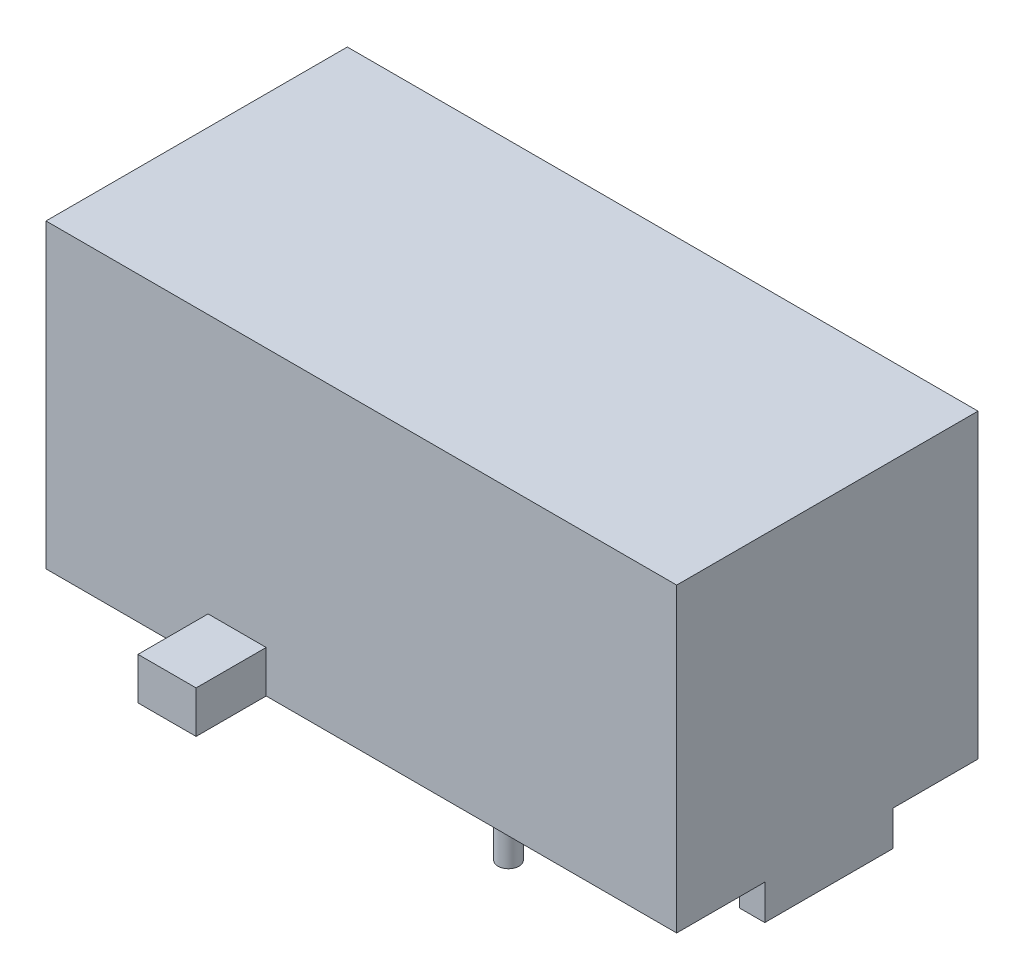
ISO-10303-21;
HEADER;
FILE_DESCRIPTION(('STEP AP214'),'2;1');
FILE_NAME('part.step','',(''),(''),'','','');
FILE_SCHEMA(('AUTOMOTIVE_DESIGN { 1 0 10303 214 1 1 1 1 }'));
ENDSEC;
DATA;
#1=APPLICATION_CONTEXT('core data for automotive mechanical design processes');
#2=APPLICATION_PROTOCOL_DEFINITION('international standard','automotive_design',2000,#1);
#3=PRODUCT_CONTEXT('',#1,'mechanical');
#4=PRODUCT('Part','Part','',(#3));
#5=PRODUCT_RELATED_PRODUCT_CATEGORY('part','',(#4));
#6=PRODUCT_DEFINITION_FORMATION('','',#4);
#7=PRODUCT_DEFINITION_CONTEXT('part definition',#1,'design');
#8=PRODUCT_DEFINITION('design','',#6,#7);
#9=PRODUCT_DEFINITION_SHAPE('','',#8);
#10=(LENGTH_UNIT() NAMED_UNIT(*) SI_UNIT(.MILLI.,.METRE.));
#11=(NAMED_UNIT(*) PLANE_ANGLE_UNIT() SI_UNIT($,.RADIAN.));
#12=(NAMED_UNIT(*) SI_UNIT($,.STERADIAN.) SOLID_ANGLE_UNIT());
#13=UNCERTAINTY_MEASURE_WITH_UNIT(LENGTH_MEASURE(1.E-05),#10,'distance_accuracy_value','');
#14=(GEOMETRIC_REPRESENTATION_CONTEXT(3) GLOBAL_UNCERTAINTY_ASSIGNED_CONTEXT((#13)) GLOBAL_UNIT_ASSIGNED_CONTEXT((#10,
#11,#12)) REPRESENTATION_CONTEXT('',''));
#15=CARTESIAN_POINT('',(0.,0.,0.));
#16=DIRECTION('',(0.,0.,1.));
#17=DIRECTION('',(1.,0.,0.));
#18=AXIS2_PLACEMENT_3D('',#15,#16,#17);
#19=CARTESIAN_POINT('',(90.,0.,43.));
#20=DIRECTION('',(0.,0.,-1.));
#21=DIRECTION('',(-1.,0.,0.));
#22=AXIS2_PLACEMENT_3D('',#19,#20,#21);
#23=PLANE('',#22);
#24=DIRECTION('',(0.,-1.,0.));
#25=VECTOR('',#24,1.);
#26=CARTESIAN_POINT('',(23.1283747452693,0.,43.));
#27=LINE('',#26,#25);
#28=CARTESIAN_POINT('',(23.1283747452693,6.0018560531816,43.));
#29=VERTEX_POINT('',#28);
#30=CARTESIAN_POINT('',(23.1283747452694,0.,43.));
#31=VERTEX_POINT('',#30);
#32=EDGE_CURVE('E49',#29,#31,#27,.T.);
#33=ORIENTED_EDGE('',*,*,#32,.F.);
#34=DIRECTION('',(-1.,0.,0.));
#35=VECTOR('',#34,1.);
#36=CARTESIAN_POINT('',(23.1283747452693,6.0018560531816,43.));
#37=LINE('',#36,#35);
#38=CARTESIAN_POINT('',(31.4201863092194,6.0018560531816,43.));
#39=VERTEX_POINT('',#38);
#40=EDGE_CURVE('E142',#39,#29,#37,.T.);
#41=ORIENTED_EDGE('',*,*,#40,.F.);
#42=DIRECTION('',(0.,1.,0.));
#43=VECTOR('',#42,1.);
#44=CARTESIAN_POINT('',(31.4201863092194,0.,43.));
#45=LINE('',#44,#43);
#46=CARTESIAN_POINT('',(31.4201863092194,0.,43.));
#47=VERTEX_POINT('',#46);
#48=EDGE_CURVE('E244',#47,#39,#45,.T.);
#49=ORIENTED_EDGE('',*,*,#48,.F.);
#50=DIRECTION('',(-1.,0.,0.));
#51=VECTOR('',#50,1.);
#52=CARTESIAN_POINT('',(90.,0.,43.));
#53=LINE('',#52,#51);
#54=CARTESIAN_POINT('',(90.,0.,43.));
#55=VERTEX_POINT('',#54);
#56=EDGE_CURVE('E202',#55,#47,#53,.T.);
#57=ORIENTED_EDGE('',*,*,#56,.F.);
#58=DIRECTION('',(0.,-1.,0.));
#59=VECTOR('',#58,1.);
#60=CARTESIAN_POINT('',(90.,0.,43.));
#61=LINE('',#60,#59);
#62=CARTESIAN_POINT('',(90.,43.,43.));
#63=VERTEX_POINT('',#62);
#64=EDGE_CURVE('E186',#63,#55,#61,.T.);
#65=ORIENTED_EDGE('',*,*,#64,.F.);
#66=DIRECTION('',(-1.,0.,0.));
#67=VECTOR('',#66,1.);
#68=CARTESIAN_POINT('',(90.,43.,43.));
#69=LINE('',#68,#67);
#70=CARTESIAN_POINT('',(0.,43.,43.));
#71=VERTEX_POINT('',#70);
#72=EDGE_CURVE('E204',#63,#71,#69,.T.);
#73=ORIENTED_EDGE('',*,*,#72,.T.);
#74=DIRECTION('',(0.,-1.,0.));
#75=VECTOR('',#74,1.);
#76=CARTESIAN_POINT('',(0.,0.,43.));
#77=LINE('',#76,#75);
#78=CARTESIAN_POINT('',(0.,0.,43.));
#79=VERTEX_POINT('',#78);
#80=EDGE_CURVE('E197',#71,#79,#77,.T.);
#81=ORIENTED_EDGE('',*,*,#80,.T.);
#82=EDGE_CURVE('E54',#31,#79,#53,.T.);
#83=ORIENTED_EDGE('',*,*,#82,.F.);
#84=EDGE_LOOP('',(#33,#41,#49,#57,#65,#73,#81,#83));
#85=FACE_BOUND('',#84,.T.);
#86=ADVANCED_FACE('F34',(#85),#23,.F.);
#87=CARTESIAN_POINT('',(90.,0.,0.));
#88=DIRECTION('',(0.,1.,0.));
#89=DIRECTION('',(0.,0.,1.));
#90=AXIS2_PLACEMENT_3D('',#87,#88,#89);
#91=PLANE('',#90);
#92=CARTESIAN_POINT('',(40.,0.,17.));
#93=DIRECTION('',(0.,1.,0.));
#94=DIRECTION('',(0.,0.,1.));
#95=AXIS2_PLACEMENT_3D('',#92,#93,#94);
#96=CIRCLE('',#95,1.5);
#97=CARTESIAN_POINT('',(40.,0.,18.5));
#98=VERTEX_POINT('',#97);
#99=EDGE_CURVE('E11',#98,#98,#96,.F.);
#100=ORIENTED_EDGE('',*,*,#99,.F.);
#101=EDGE_LOOP('',(#100));
#102=FACE_BOUND('',#101,.T.);
#103=DIRECTION('',(-1.,0.,0.));
#104=VECTOR('',#103,1.);
#105=CARTESIAN_POINT('',(90.,0.,30.429894194171));
#106=LINE('',#105,#104);
#107=CARTESIAN_POINT('',(90.,0.,30.429894194171));
#108=VERTEX_POINT('',#107);
#109=CARTESIAN_POINT('',(86.4005907050114,0.,30.429894194171));
#110=VERTEX_POINT('',#109);
#111=EDGE_CURVE('E145',#108,#110,#106,.T.);
#112=ORIENTED_EDGE('',*,*,#111,.F.);
#113=DIRECTION('',(0.,0.,-1.));
#114=VECTOR('',#113,1.);
#115=CARTESIAN_POINT('',(90.,0.,0.));
#116=LINE('',#115,#114);
#117=EDGE_CURVE('E189',#55,#108,#116,.T.);
#118=ORIENTED_EDGE('',*,*,#117,.F.);
#119=ORIENTED_EDGE('',*,*,#56,.T.);
#120=DIRECTION('',(0.,0.,-1.));
#121=VECTOR('',#120,1.);
#122=CARTESIAN_POINT('',(31.4201863092194,0.,53.));
#123=LINE('',#122,#121);
#124=CARTESIAN_POINT('',(31.4201863092194,0.,53.));
#125=VERTEX_POINT('',#124);
#126=EDGE_CURVE('E129',#125,#47,#123,.T.);
#127=ORIENTED_EDGE('',*,*,#126,.F.);
#128=DIRECTION('',(1.,0.,0.));
#129=VECTOR('',#128,1.);
#130=CARTESIAN_POINT('',(23.1283747452693,0.,53.));
#131=LINE('',#130,#129);
#132=CARTESIAN_POINT('',(23.1283747452693,0.,53.));
#133=VERTEX_POINT('',#132);
#134=EDGE_CURVE('E121',#133,#125,#131,.T.);
#135=ORIENTED_EDGE('',*,*,#134,.F.);
#136=DIRECTION('',(0.,0.,-1.));
#137=VECTOR('',#136,1.);
#138=CARTESIAN_POINT('',(23.1283747452693,0.,53.));
#139=LINE('',#138,#137);
#140=EDGE_CURVE('E126',#133,#31,#139,.T.);
#141=ORIENTED_EDGE('',*,*,#140,.T.);
#142=ORIENTED_EDGE('',*,*,#82,.T.);
#143=DIRECTION('',(0.,0.,-1.));
#144=VECTOR('',#143,1.);
#145=CARTESIAN_POINT('',(0.,0.,0.));
#146=LINE('',#145,#144);
#147=CARTESIAN_POINT('',(0.,0.,0.));
#148=VERTEX_POINT('',#147);
#149=EDGE_CURVE('E184',#79,#148,#146,.T.);
#150=ORIENTED_EDGE('',*,*,#149,.T.);
#151=DIRECTION('',(-1.,0.,0.));
#152=VECTOR('',#151,1.);
#153=CARTESIAN_POINT('',(90.,0.,0.));
#154=LINE('',#153,#152);
#155=CARTESIAN_POINT('',(90.,0.,0.));
#156=VERTEX_POINT('',#155);
#157=EDGE_CURVE('E192',#156,#148,#154,.T.);
#158=ORIENTED_EDGE('',*,*,#157,.F.);
#159=CARTESIAN_POINT('',(90.,0.,12.1029587985344));
#160=VERTEX_POINT('',#159);
#161=EDGE_CURVE('E188',#160,#156,#116,.T.);
#162=ORIENTED_EDGE('',*,*,#161,.F.);
#163=DIRECTION('',(1.,0.,0.));
#164=VECTOR('',#163,1.);
#165=CARTESIAN_POINT('',(90.,0.,12.1029587985344));
#166=LINE('',#165,#164);
#167=CARTESIAN_POINT('',(86.4005907050114,0.,12.1029587985344));
#168=VERTEX_POINT('',#167);
#169=EDGE_CURVE('E157',#168,#160,#166,.T.);
#170=ORIENTED_EDGE('',*,*,#169,.F.);
#171=DIRECTION('',(0.,0.,-1.));
#172=VECTOR('',#171,1.);
#173=CARTESIAN_POINT('',(86.4005907050114,0.,30.429894194171));
#174=LINE('',#173,#172);
#175=EDGE_CURVE('E147',#110,#168,#174,.T.);
#176=ORIENTED_EDGE('',*,*,#175,.F.);
#177=EDGE_LOOP('',(#112,#118,#119,#127,#135,#141,#142,#150,#158,#162,#170,#176));
#178=FACE_BOUND('',#177,.T.);
#179=ADVANCED_FACE('F124',(#102,#178),#91,.F.);
#180=CARTESIAN_POINT('',(90.,0.,0.));
#181=DIRECTION('',(0.,0.,1.));
#182=DIRECTION('',(1.,0.,0.));
#183=AXIS2_PLACEMENT_3D('',#180,#181,#182);
#184=PLANE('',#183);
#185=DIRECTION('',(0.,1.,0.));
#186=VECTOR('',#185,1.);
#187=CARTESIAN_POINT('',(0.,0.,0.));
#188=LINE('',#187,#186);
#189=CARTESIAN_POINT('',(0.,43.,0.));
#190=VERTEX_POINT('',#189);
#191=EDGE_CURVE('E179',#148,#190,#188,.T.);
#192=ORIENTED_EDGE('',*,*,#191,.T.);
#193=DIRECTION('',(-1.,0.,0.));
#194=VECTOR('',#193,1.);
#195=CARTESIAN_POINT('',(90.,43.,0.));
#196=LINE('',#195,#194);
#197=CARTESIAN_POINT('',(90.,43.,0.));
#198=VERTEX_POINT('',#197);
#199=EDGE_CURVE('E42',#198,#190,#196,.T.);
#200=ORIENTED_EDGE('',*,*,#199,.F.);
#201=DIRECTION('',(0.,1.,0.));
#202=VECTOR('',#201,1.);
#203=CARTESIAN_POINT('',(90.,0.,0.));
#204=LINE('',#203,#202);
#205=EDGE_CURVE('E180',#156,#198,#204,.T.);
#206=ORIENTED_EDGE('',*,*,#205,.F.);
#207=ORIENTED_EDGE('',*,*,#157,.T.);
#208=EDGE_LOOP('',(#192,#200,#206,#207));
#209=FACE_BOUND('',#208,.T.);
#210=ADVANCED_FACE('F36',(#209),#184,.F.);
#211=CARTESIAN_POINT('',(90.,43.,0.));
#212=DIRECTION('',(0.,-1.,0.));
#213=DIRECTION('',(0.,0.,-1.));
#214=AXIS2_PLACEMENT_3D('',#211,#212,#213);
#215=PLANE('',#214);
#216=DIRECTION('',(0.,0.,1.));
#217=VECTOR('',#216,1.);
#218=CARTESIAN_POINT('',(0.,43.,0.));
#219=LINE('',#218,#217);
#220=EDGE_CURVE('E195',#190,#71,#219,.T.);
#221=ORIENTED_EDGE('',*,*,#220,.T.);
#222=ORIENTED_EDGE('',*,*,#72,.F.);
#223=DIRECTION('',(0.,0.,1.));
#224=VECTOR('',#223,1.);
#225=CARTESIAN_POINT('',(90.,43.,0.));
#226=LINE('',#225,#224);
#227=EDGE_CURVE('E183',#198,#63,#226,.T.);
#228=ORIENTED_EDGE('',*,*,#227,.F.);
#229=ORIENTED_EDGE('',*,*,#199,.T.);
#230=EDGE_LOOP('',(#221,#222,#228,#229));
#231=FACE_BOUND('',#230,.T.);
#232=ADVANCED_FACE('F209',(#231),#215,.F.);
#233=CARTESIAN_POINT('',(90.,0.,0.));
#234=DIRECTION('',(1.,0.,0.));
#235=DIRECTION('',(0.,0.,-1.));
#236=AXIS2_PLACEMENT_3D('',#233,#234,#235);
#237=PLANE('',#236);
#238=ORIENTED_EDGE('',*,*,#205,.T.);
#239=ORIENTED_EDGE('',*,*,#227,.T.);
#240=ORIENTED_EDGE('',*,*,#64,.T.);
#241=ORIENTED_EDGE('',*,*,#117,.T.);
#242=DIRECTION('',(0.,1.,0.));
#243=VECTOR('',#242,1.);
#244=CARTESIAN_POINT('',(90.,-5.,30.429894194171));
#245=LINE('',#244,#243);
#246=CARTESIAN_POINT('',(90.,-5.,30.429894194171));
#247=VERTEX_POINT('',#246);
#248=EDGE_CURVE('E174',#247,#108,#245,.T.);
#249=ORIENTED_EDGE('',*,*,#248,.F.);
#250=DIRECTION('',(0.,0.,1.));
#251=VECTOR('',#250,1.);
#252=CARTESIAN_POINT('',(90.,-5.,30.429894194171));
#253=LINE('',#252,#251);
#254=CARTESIAN_POINT('',(90.,-5.,12.1029587985344));
#255=VERTEX_POINT('',#254);
#256=EDGE_CURVE('E153',#255,#247,#253,.T.);
#257=ORIENTED_EDGE('',*,*,#256,.F.);
#258=DIRECTION('',(0.,1.,0.));
#259=VECTOR('',#258,1.);
#260=CARTESIAN_POINT('',(90.,-5.,12.1029587985344));
#261=LINE('',#260,#259);
#262=EDGE_CURVE('E162',#255,#160,#261,.T.);
#263=ORIENTED_EDGE('',*,*,#262,.T.);
#264=ORIENTED_EDGE('',*,*,#161,.T.);
#265=EDGE_LOOP('',(#238,#239,#240,#241,#249,#257,#263,#264));
#266=FACE_BOUND('',#265,.T.);
#267=ADVANCED_FACE('F223',(#266),#237,.T.);
#268=CARTESIAN_POINT('',(0.,0.,0.));
#269=DIRECTION('',(1.,0.,0.));
#270=DIRECTION('',(0.,0.,-1.));
#271=AXIS2_PLACEMENT_3D('',#268,#269,#270);
#272=PLANE('',#271);
#273=ORIENTED_EDGE('',*,*,#191,.F.);
#274=ORIENTED_EDGE('',*,*,#149,.F.);
#275=ORIENTED_EDGE('',*,*,#80,.F.);
#276=ORIENTED_EDGE('',*,*,#220,.F.);
#277=EDGE_LOOP('',(#273,#274,#275,#276));
#278=FACE_BOUND('',#277,.T.);
#279=ADVANCED_FACE('F217',(#278),#272,.F.);
#280=CARTESIAN_POINT('',(40.,-29.,17.));
#281=DIRECTION('',(0.,1.,0.));
#282=DIRECTION('',(0.,0.,1.));
#283=AXIS2_PLACEMENT_3D('',#280,#281,#282);
#284=CYLINDRICAL_SURFACE('',#283,1.5);
#285=CARTESIAN_POINT('',(40.,-29.,17.));
#286=DIRECTION('',(0.,-1.,0.));
#287=DIRECTION('',(0.,0.,-1.));
#288=AXIS2_PLACEMENT_3D('',#285,#286,#287);
#289=CIRCLE('',#288,1.5);
#290=CARTESIAN_POINT('',(40.,-29.,18.5));
#291=VERTEX_POINT('',#290);
#292=EDGE_CURVE('E176',#291,#291,#289,.T.);
#293=CARTESIAN_POINT('',(40.,-29.,18.5));
#294=CARTESIAN_POINT('',(40.,-28.6979166666667,18.5));
#295=CARTESIAN_POINT('',(40.,-28.3958333333333,18.5));
#296=CARTESIAN_POINT('',(40.,-27.7916666666667,18.5));
#297=CARTESIAN_POINT('',(40.,-27.4895833333333,18.5));
#298=CARTESIAN_POINT('',(40.,-26.8854166666667,18.5));
#299=CARTESIAN_POINT('',(40.,-26.5833333333333,18.5));
#300=CARTESIAN_POINT('',(40.,-25.9791666666667,18.5));
#301=CARTESIAN_POINT('',(40.,-25.6770833333333,18.5));
#302=CARTESIAN_POINT('',(40.,-25.0729166666667,18.5));
#303=CARTESIAN_POINT('',(40.,-24.7708333333333,18.5));
#304=CARTESIAN_POINT('',(40.,-24.1666666666667,18.5));
#305=CARTESIAN_POINT('',(40.,-23.8645833333333,18.5));
#306=CARTESIAN_POINT('',(40.,-23.2604166666667,18.5));
#307=CARTESIAN_POINT('',(40.,-22.9583333333333,18.5));
#308=CARTESIAN_POINT('',(40.,-22.3541666666667,18.5));
#309=CARTESIAN_POINT('',(40.,-22.0520833333333,18.5));
#310=CARTESIAN_POINT('',(40.,-21.4479166666667,18.5));
#311=CARTESIAN_POINT('',(40.,-21.1458333333333,18.5));
#312=CARTESIAN_POINT('',(40.,-20.5416666666667,18.5));
#313=CARTESIAN_POINT('',(40.,-20.2395833333333,18.5));
#314=CARTESIAN_POINT('',(40.,-19.6354166666667,18.5));
#315=CARTESIAN_POINT('',(40.,-19.3333333333333,18.5));
#316=CARTESIAN_POINT('',(40.,-18.7291666666667,18.5));
#317=CARTESIAN_POINT('',(40.,-18.4270833333333,18.5));
#318=CARTESIAN_POINT('',(40.,-17.8229166666667,18.5));
#319=CARTESIAN_POINT('',(40.,-17.5208333333333,18.5));
#320=CARTESIAN_POINT('',(40.,-16.9166666666667,18.5));
#321=CARTESIAN_POINT('',(40.,-16.6145833333333,18.5));
#322=CARTESIAN_POINT('',(40.,-16.0104166666667,18.5));
#323=CARTESIAN_POINT('',(40.,-15.7083333333333,18.5));
#324=CARTESIAN_POINT('',(40.,-15.1041666666667,18.5));
#325=CARTESIAN_POINT('',(40.,-14.8020833333333,18.5));
#326=CARTESIAN_POINT('',(40.,-14.1979166666667,18.5));
#327=CARTESIAN_POINT('',(40.,-13.8958333333333,18.5));
#328=CARTESIAN_POINT('',(40.,-13.2916666666667,18.5));
#329=CARTESIAN_POINT('',(40.,-12.9895833333333,18.5));
#330=CARTESIAN_POINT('',(40.,-12.3854166666667,18.5));
#331=CARTESIAN_POINT('',(40.,-12.0833333333333,18.5));
#332=CARTESIAN_POINT('',(40.,-11.4791666666667,18.5));
#333=CARTESIAN_POINT('',(40.,-11.1770833333333,18.5));
#334=CARTESIAN_POINT('',(40.,-10.5729166666667,18.5));
#335=CARTESIAN_POINT('',(40.,-10.2708333333333,18.5));
#336=CARTESIAN_POINT('',(40.,-9.66666666666667,18.5));
#337=CARTESIAN_POINT('',(40.,-9.36458333333333,18.5));
#338=CARTESIAN_POINT('',(40.,-8.76041666666667,18.5));
#339=CARTESIAN_POINT('',(40.,-8.45833333333333,18.5));
#340=CARTESIAN_POINT('',(40.,-7.85416666666667,18.5));
#341=CARTESIAN_POINT('',(40.,-7.55208333333333,18.5));
#342=CARTESIAN_POINT('',(40.,-6.94791666666667,18.5));
#343=CARTESIAN_POINT('',(40.,-6.64583333333333,18.5));
#344=CARTESIAN_POINT('',(40.,-6.04166666666667,18.5));
#345=CARTESIAN_POINT('',(40.,-5.73958333333333,18.5));
#346=CARTESIAN_POINT('',(40.,-5.13541666666667,18.5));
#347=CARTESIAN_POINT('',(40.,-4.83333333333333,18.5));
#348=CARTESIAN_POINT('',(40.,-4.22916666666667,18.5));
#349=CARTESIAN_POINT('',(40.,-3.92708333333333,18.5));
#350=CARTESIAN_POINT('',(40.,-3.32291666666667,18.5));
#351=CARTESIAN_POINT('',(40.,-3.02083333333333,18.5));
#352=CARTESIAN_POINT('',(40.,-2.41666666666667,18.5));
#353=CARTESIAN_POINT('',(40.,-2.11458333333333,18.5));
#354=CARTESIAN_POINT('',(40.,-1.51041666666667,18.5));
#355=CARTESIAN_POINT('',(40.,-1.20833333333333,18.5));
#356=CARTESIAN_POINT('',(40.,-0.604166666666667,18.5));
#357=CARTESIAN_POINT('',(40.,-0.302083333333333,18.5));
#358=CARTESIAN_POINT('',(40.,0.,18.5));
#359=B_SPLINE_CURVE_WITH_KNOTS('',3,(#293,#294,#295,#296,#297,#298,#299,#300,#301,#302,#303,
#304,#305,#306,#307,#308,#309,#310,#311,#312,#313,#314,#315,#316,#317,#318,#319,#320,#321,#322,
#323,#324,#325,#326,#327,#328,#329,#330,#331,#332,#333,#334,#335,#336,#337,#338,#339,#340,#341,
#342,#343,#344,#345,#346,#347,#348,#349,#350,#351,#352,#353,#354,#355,#356,#357,#358),
.UNSPECIFIED.,.F.,.F.,(4,2,2,2,2,2,2,2,2,2,2,2,2,2,2,2,2,2,2,2,2,2,2,2,2,2,2,2,2,2,2,2,4),(0.,
0.906250000000001,1.8125,2.71875,3.625,4.53125,5.4375,6.34375,7.25,8.15625,9.0625,9.96875,
10.875,11.78125,12.6875,13.59375,14.5,15.40625,16.3125,17.21875,18.125,19.03125,19.9375,
20.84375,21.75,22.65625,23.5625,24.46875,25.375,26.28125,27.1875,28.09375,29.),.UNSPECIFIED.);
#360=EDGE_CURVE('BSEAM346',#291,#98,#359,.T.);
#361=ORIENTED_EDGE('',*,*,#292,.F.);
#362=ORIENTED_EDGE('',*,*,#99,.T.);
#363=ORIENTED_EDGE('',*,*,#360,.T.);
#364=ORIENTED_EDGE('',*,*,#360,.F.);
#365=EDGE_LOOP('',(#361,#363,#362,#364));
#366=FACE_BOUND('',#365,.T.);
#367=ADVANCED_FACE('F346',(#366),#284,.T.);
#368=CARTESIAN_POINT('',(40.,-29.,17.));
#369=DIRECTION('',(0.,-1.,0.));
#370=DIRECTION('',(0.,0.,-1.));
#371=AXIS2_PLACEMENT_3D('',#368,#369,#370);
#372=PLANE('',#371);
#373=ORIENTED_EDGE('',*,*,#292,.T.);
#374=EDGE_LOOP('',(#373));
#375=FACE_BOUND('',#374,.T.);
#376=ADVANCED_FACE('F338',(#375),#372,.T.);
#377=CARTESIAN_POINT('',(90.,-5.,30.429894194171));
#378=DIRECTION('',(0.,0.,-1.));
#379=DIRECTION('',(-1.,0.,0.));
#380=AXIS2_PLACEMENT_3D('',#377,#378,#379);
#381=PLANE('',#380);
#382=ORIENTED_EDGE('',*,*,#111,.T.);
#383=DIRECTION('',(0.,1.,0.));
#384=VECTOR('',#383,1.);
#385=CARTESIAN_POINT('',(86.4005907050114,-5.,30.429894194171));
#386=LINE('',#385,#384);
#387=CARTESIAN_POINT('',(86.4005907050114,-5.,30.429894194171));
#388=VERTEX_POINT('',#387);
#389=EDGE_CURVE('E171',#388,#110,#386,.T.);
#390=ORIENTED_EDGE('',*,*,#389,.F.);
#391=DIRECTION('',(-1.,0.,0.));
#392=VECTOR('',#391,1.);
#393=CARTESIAN_POINT('',(90.,-5.,30.429894194171));
#394=LINE('',#393,#392);
#395=EDGE_CURVE('E156',#247,#388,#394,.T.);
#396=ORIENTED_EDGE('',*,*,#395,.F.);
#397=ORIENTED_EDGE('',*,*,#248,.T.);
#398=EDGE_LOOP('',(#382,#390,#396,#397));
#399=FACE_BOUND('',#398,.T.);
#400=ADVANCED_FACE('F239',(#399),#381,.F.);
#401=CARTESIAN_POINT('',(86.4005907050114,-5.,30.429894194171));
#402=DIRECTION('',(1.,0.,0.));
#403=DIRECTION('',(0.,0.,-1.));
#404=AXIS2_PLACEMENT_3D('',#401,#402,#403);
#405=PLANE('',#404);
#406=ORIENTED_EDGE('',*,*,#175,.T.);
#407=DIRECTION('',(0.,1.,0.));
#408=VECTOR('',#407,1.);
#409=CARTESIAN_POINT('',(86.4005907050114,-5.,12.1029587985344));
#410=LINE('',#409,#408);
#411=CARTESIAN_POINT('',(86.4005907050114,-5.,12.1029587985344));
#412=VERTEX_POINT('',#411);
#413=EDGE_CURVE('E168',#412,#168,#410,.T.);
#414=ORIENTED_EDGE('',*,*,#413,.F.);
#415=DIRECTION('',(0.,0.,-1.));
#416=VECTOR('',#415,1.);
#417=CARTESIAN_POINT('',(86.4005907050114,-5.,30.429894194171));
#418=LINE('',#417,#416);
#419=EDGE_CURVE('E159',#388,#412,#418,.T.);
#420=ORIENTED_EDGE('',*,*,#419,.F.);
#421=ORIENTED_EDGE('',*,*,#389,.T.);
#422=EDGE_LOOP('',(#406,#414,#420,#421));
#423=FACE_BOUND('',#422,.T.);
#424=ADVANCED_FACE('F236',(#423),#405,.F.);
#425=CARTESIAN_POINT('',(90.,-5.,12.1029587985344));
#426=DIRECTION('',(0.,0.,1.));
#427=DIRECTION('',(1.,0.,0.));
#428=AXIS2_PLACEMENT_3D('',#425,#426,#427);
#429=PLANE('',#428);
#430=ORIENTED_EDGE('',*,*,#169,.T.);
#431=ORIENTED_EDGE('',*,*,#262,.F.);
#432=DIRECTION('',(1.,0.,0.));
#433=VECTOR('',#432,1.);
#434=CARTESIAN_POINT('',(90.,-5.,12.1029587985344));
#435=LINE('',#434,#433);
#436=EDGE_CURVE('E161',#412,#255,#435,.T.);
#437=ORIENTED_EDGE('',*,*,#436,.F.);
#438=ORIENTED_EDGE('',*,*,#413,.T.);
#439=EDGE_LOOP('',(#430,#431,#437,#438));
#440=FACE_BOUND('',#439,.T.);
#441=ADVANCED_FACE('F231',(#440),#429,.F.);
#442=CARTESIAN_POINT('',(0.,-5.,0.));
#443=DIRECTION('',(0.,1.,0.));
#444=DIRECTION('',(0.,0.,1.));
#445=AXIS2_PLACEMENT_3D('',#442,#443,#444);
#446=PLANE('',#445);
#447=ORIENTED_EDGE('',*,*,#256,.T.);
#448=ORIENTED_EDGE('',*,*,#395,.T.);
#449=ORIENTED_EDGE('',*,*,#419,.T.);
#450=ORIENTED_EDGE('',*,*,#436,.T.);
#451=EDGE_LOOP('',(#447,#448,#449,#450));
#452=FACE_BOUND('',#451,.T.);
#453=ADVANCED_FACE('F296',(#452),#446,.F.);
#454=CARTESIAN_POINT('',(23.1283747452693,0.,53.));
#455=DIRECTION('',(1.,0.,0.));
#456=DIRECTION('',(0.,0.,-1.));
#457=AXIS2_PLACEMENT_3D('',#454,#455,#456);
#458=PLANE('',#457);
#459=ORIENTED_EDGE('',*,*,#32,.T.);
#460=ORIENTED_EDGE('',*,*,#140,.F.);
#461=DIRECTION('',(0.,-1.,0.));
#462=VECTOR('',#461,1.);
#463=CARTESIAN_POINT('',(23.1283747452693,0.,53.));
#464=LINE('',#463,#462);
#465=CARTESIAN_POINT('',(23.1283747452693,6.0018560531816,53.));
#466=VERTEX_POINT('',#465);
#467=EDGE_CURVE('E133',#466,#133,#464,.T.);
#468=ORIENTED_EDGE('',*,*,#467,.F.);
#469=DIRECTION('',(0.,0.,-1.));
#470=VECTOR('',#469,1.);
#471=CARTESIAN_POINT('',(23.1283747452693,6.0018560531816,53.));
#472=LINE('',#471,#470);
#473=EDGE_CURVE('E247',#466,#29,#472,.T.);
#474=ORIENTED_EDGE('',*,*,#473,.T.);
#475=EDGE_LOOP('',(#459,#460,#468,#474));
#476=FACE_BOUND('',#475,.T.);
#477=ADVANCED_FACE('F144',(#476),#458,.F.);
#478=CARTESIAN_POINT('',(31.4201863092194,0.,53.));
#479=DIRECTION('',(-1.,0.,0.));
#480=DIRECTION('',(0.,0.,1.));
#481=AXIS2_PLACEMENT_3D('',#478,#479,#480);
#482=PLANE('',#481);
#483=ORIENTED_EDGE('',*,*,#48,.T.);
#484=DIRECTION('',(0.,0.,-1.));
#485=VECTOR('',#484,1.);
#486=CARTESIAN_POINT('',(31.4201863092194,6.0018560531816,53.));
#487=LINE('',#486,#485);
#488=CARTESIAN_POINT('',(31.4201863092194,6.0018560531816,53.));
#489=VERTEX_POINT('',#488);
#490=EDGE_CURVE('E149',#489,#39,#487,.T.);
#491=ORIENTED_EDGE('',*,*,#490,.F.);
#492=DIRECTION('',(0.,1.,0.));
#493=VECTOR('',#492,1.);
#494=CARTESIAN_POINT('',(31.4201863092194,0.,53.));
#495=LINE('',#494,#493);
#496=EDGE_CURVE('E132',#125,#489,#495,.T.);
#497=ORIENTED_EDGE('',*,*,#496,.F.);
#498=ORIENTED_EDGE('',*,*,#126,.T.);
#499=EDGE_LOOP('',(#483,#491,#497,#498));
#500=FACE_BOUND('',#499,.T.);
#501=ADVANCED_FACE('F242',(#500),#482,.F.);
#502=CARTESIAN_POINT('',(23.1283747452693,6.0018560531816,53.));
#503=DIRECTION('',(0.,-1.,0.));
#504=DIRECTION('',(0.,0.,-1.));
#505=AXIS2_PLACEMENT_3D('',#502,#503,#504);
#506=PLANE('',#505);
#507=ORIENTED_EDGE('',*,*,#40,.T.);
#508=ORIENTED_EDGE('',*,*,#473,.F.);
#509=DIRECTION('',(-1.,0.,0.));
#510=VECTOR('',#509,1.);
#511=CARTESIAN_POINT('',(23.1283747452693,6.0018560531816,53.));
#512=LINE('',#511,#510);
#513=EDGE_CURVE('E138',#489,#466,#512,.T.);
#514=ORIENTED_EDGE('',*,*,#513,.F.);
#515=ORIENTED_EDGE('',*,*,#490,.T.);
#516=EDGE_LOOP('',(#507,#508,#514,#515));
#517=FACE_BOUND('',#516,.T.);
#518=ADVANCED_FACE('F254',(#517),#506,.F.);
#519=CARTESIAN_POINT('',(0.,0.,53.));
#520=DIRECTION('',(0.,0.,-1.));
#521=DIRECTION('',(-1.,0.,0.));
#522=AXIS2_PLACEMENT_3D('',#519,#520,#521);
#523=PLANE('',#522);
#524=ORIENTED_EDGE('',*,*,#467,.T.);
#525=ORIENTED_EDGE('',*,*,#134,.T.);
#526=ORIENTED_EDGE('',*,*,#496,.T.);
#527=ORIENTED_EDGE('',*,*,#513,.T.);
#528=EDGE_LOOP('',(#524,#525,#526,#527));
#529=FACE_BOUND('',#528,.T.);
#530=ADVANCED_FACE('F136',(#529),#523,.F.);
#531=CLOSED_SHELL('',(#86,#179,#210,#232,#267,#279,#367,#376,#400,#424,#441,#453,#477,#501,#518,#530));
#532=MANIFOLD_SOLID_BREP('B2',#531);
#533=ADVANCED_BREP_SHAPE_REPRESENTATION('',(#18,#532),#14);
#534=SHAPE_DEFINITION_REPRESENTATION(#9,#533);
ENDSEC;
END-ISO-10303-21;
